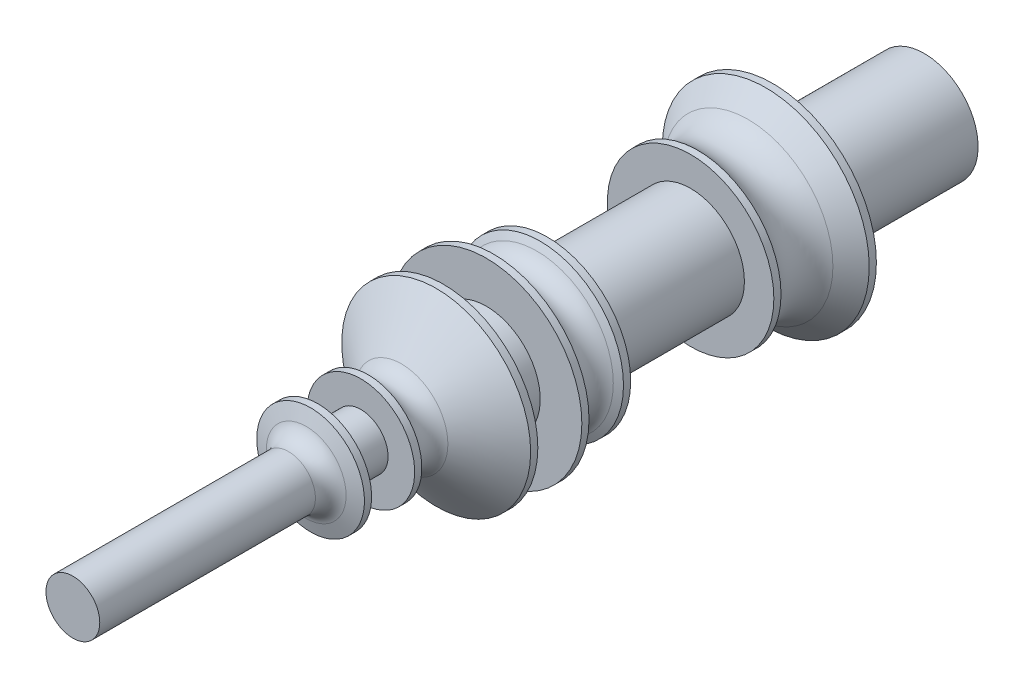
ISO-10303-21;
HEADER;
FILE_DESCRIPTION(('STEP AP214'),'2;1');
FILE_NAME('part.step','',(''),(''),'','','');
FILE_SCHEMA(('AUTOMOTIVE_DESIGN { 1 0 10303 214 1 1 1 1 }'));
ENDSEC;
DATA;
#1=APPLICATION_CONTEXT('core data for automotive mechanical design processes');
#2=APPLICATION_PROTOCOL_DEFINITION('international standard','automotive_design',2000,#1);
#3=PRODUCT_CONTEXT('',#1,'mechanical');
#4=PRODUCT('Part','Part','',(#3));
#5=PRODUCT_RELATED_PRODUCT_CATEGORY('part','',(#4));
#6=PRODUCT_DEFINITION_FORMATION('','',#4);
#7=PRODUCT_DEFINITION_CONTEXT('part definition',#1,'design');
#8=PRODUCT_DEFINITION('design','',#6,#7);
#9=PRODUCT_DEFINITION_SHAPE('','',#8);
#10=(LENGTH_UNIT() NAMED_UNIT(*) SI_UNIT(.MILLI.,.METRE.));
#11=(NAMED_UNIT(*) PLANE_ANGLE_UNIT() SI_UNIT($,.RADIAN.));
#12=(NAMED_UNIT(*) SI_UNIT($,.STERADIAN.) SOLID_ANGLE_UNIT());
#13=UNCERTAINTY_MEASURE_WITH_UNIT(LENGTH_MEASURE(1.E-05),#10,'distance_accuracy_value','');
#14=(GEOMETRIC_REPRESENTATION_CONTEXT(3) GLOBAL_UNCERTAINTY_ASSIGNED_CONTEXT((#13)) GLOBAL_UNIT_ASSIGNED_CONTEXT((#10,
#11,#12)) REPRESENTATION_CONTEXT('',''));
#15=CARTESIAN_POINT('',(0.,0.,0.));
#16=DIRECTION('',(0.,0.,1.));
#17=DIRECTION('',(1.,0.,0.));
#18=AXIS2_PLACEMENT_3D('',#15,#16,#17);
#19=CARTESIAN_POINT('',(0.,0.,520.866865037144));
#20=DIRECTION('',(0.,0.,-1.));
#21=DIRECTION('',(-1.,0.,0.));
#22=AXIS2_PLACEMENT_3D('',#19,#20,#21);
#23=CYLINDRICAL_SURFACE('',#22,43.49025);
#24=CARTESIAN_POINT('',(0.,0.,-44.7963199628567));
#25=DIRECTION('',(0.,0.,-1.));
#26=DIRECTION('',(-1.,0.,0.));
#27=AXIS2_PLACEMENT_3D('',#24,#25,#26);
#28=CIRCLE('',#27,43.49025);
#29=CARTESIAN_POINT('',(-43.49025,0.,-44.7963199628567));
#30=VERTEX_POINT('',#29);
#31=EDGE_CURVE('E68',#30,#30,#28,.T.);
#32=ORIENTED_EDGE('',*,*,#31,.T.);
#33=EDGE_LOOP('',(#32));
#34=FACE_BOUND('',#33,.T.);
#35=CARTESIAN_POINT('',(0.,0.,-167.110579962857));
#36=DIRECTION('',(0.,0.,-1.));
#37=DIRECTION('',(-1.,0.,0.));
#38=AXIS2_PLACEMENT_3D('',#35,#36,#37);
#39=CIRCLE('',#38,43.49025);
#40=CARTESIAN_POINT('',(-43.49025,0.,-167.110579962857));
#41=VERTEX_POINT('',#40);
#42=EDGE_CURVE('E128',#41,#41,#39,.T.);
#43=ORIENTED_EDGE('',*,*,#42,.F.);
#44=EDGE_LOOP('',(#43));
#45=FACE_BOUND('',#44,.T.);
#46=ADVANCED_FACE('F33',(#34,#45),#23,.T.);
#47=CARTESIAN_POINT('',(43.49025,0.,-44.7963199628567));
#48=DIRECTION('',(0.,0.,-1.));
#49=DIRECTION('',(-1.,0.,0.));
#50=AXIS2_PLACEMENT_3D('',#47,#48,#49);
#51=PLANE('',#50);
#52=ORIENTED_EDGE('',*,*,#31,.F.);
#53=EDGE_LOOP('',(#52));
#54=FACE_BOUND('',#53,.T.);
#55=CARTESIAN_POINT('',(0.,0.,-44.7963199628567));
#56=DIRECTION('',(0.,0.,1.));
#57=DIRECTION('',(1.,0.,0.));
#58=AXIS2_PLACEMENT_3D('',#55,#56,#57);
#59=CIRCLE('',#58,83.6327898078919);
#60=CARTESIAN_POINT('',(83.6327898078919,0.,-44.7963199628567));
#61=VERTEX_POINT('',#60);
#62=EDGE_CURVE('E77',#61,#61,#59,.T.);
#63=ORIENTED_EDGE('',*,*,#62,.F.);
#64=EDGE_LOOP('',(#63));
#65=FACE_BOUND('',#64,.T.);
#66=ADVANCED_FACE('F135',(#54,#65),#51,.T.);
#67=CARTESIAN_POINT('',(0.,0.,165.83626259305));
#68=DIRECTION('',(0.,0.,1.));
#69=DIRECTION('',(1.,0.,0.));
#70=AXIS2_PLACEMENT_3D('',#67,#68,#69);
#71=CYLINDRICAL_SURFACE('',#70,83.6327898078919);
#72=ORIENTED_EDGE('',*,*,#62,.T.);
#73=EDGE_LOOP('',(#72));
#74=FACE_BOUND('',#73,.T.);
#75=CARTESIAN_POINT('',(0.,0.,-38.9976199628567));
#76=DIRECTION('',(0.,0.,1.));
#77=DIRECTION('',(1.,0.,0.));
#78=AXIS2_PLACEMENT_3D('',#75,#76,#77);
#79=CIRCLE('',#78,83.6327898078919);
#80=CARTESIAN_POINT('',(83.6327898078919,0.,-38.9976199628567));
#81=VERTEX_POINT('',#80);
#82=EDGE_CURVE('E80',#81,#81,#79,.T.);
#83=ORIENTED_EDGE('',*,*,#82,.F.);
#84=EDGE_LOOP('',(#83));
#85=FACE_BOUND('',#84,.T.);
#86=ADVANCED_FACE('F143',(#74,#85),#71,.T.);
#87=CARTESIAN_POINT('',(0.,0.,-4.19031632053388));
#88=DIRECTION('',(0.,0.,-1.));
#89=DIRECTION('',(-1.,0.,0.));
#90=AXIS2_PLACEMENT_3D('',#87,#88,#89);
#91=CONICAL_SURFACE('',#90,47.1696865476448,0.808626623530185);
#92=CARTESIAN_POINT('',(0.,0.,-24.6623152596806));
#93=DIRECTION('',(0.,0.,-1.));
#94=DIRECTION('',(-1.,0.,0.));
#95=AXIS2_PLACEMENT_3D('',#92,#93,#94);
#96=CIRCLE('',#95,68.6155479947844);
#97=CARTESIAN_POINT('',(-68.6155479947844,0.,-24.6623152596806));
#98=VERTEX_POINT('',#97);
#99=EDGE_CURVE('E65',#98,#98,#96,.T.);
#100=ORIENTED_EDGE('',*,*,#99,.T.);
#101=EDGE_LOOP('',(#100));
#102=FACE_BOUND('',#101,.T.);
#103=ORIENTED_EDGE('',*,*,#82,.T.);
#104=EDGE_LOOP('',(#103));
#105=FACE_BOUND('',#104,.T.);
#106=ADVANCED_FACE('F236',(#102,#105),#91,.T.);
#107=CARTESIAN_POINT('',(0.,0.,165.83626259305));
#108=DIRECTION('',(0.,0.,1.));
#109=DIRECTION('',(1.,0.,0.));
#110=AXIS2_PLACEMENT_3D('',#107,#108,#109);
#111=CYLINDRICAL_SURFACE('',#110,67.2760719053221);
#112=CARTESIAN_POINT('',(0.,0.,15.9160690371434));
#113=DIRECTION('',(0.,0.,1.));
#114=DIRECTION('',(1.,0.,0.));
#115=AXIS2_PLACEMENT_3D('',#112,#113,#114);
#116=CIRCLE('',#115,67.2760719053221);
#117=CARTESIAN_POINT('',(67.2760719053221,0.,15.9160690371434));
#118=VERTEX_POINT('',#117);
#119=EDGE_CURVE('E83',#118,#118,#116,.T.);
#120=ORIENTED_EDGE('',*,*,#119,.T.);
#121=EDGE_LOOP('',(#120));
#122=FACE_BOUND('',#121,.T.);
#123=CARTESIAN_POINT('',(0.,0.,21.7147690371434));
#124=DIRECTION('',(0.,0.,1.));
#125=DIRECTION('',(1.,0.,0.));
#126=AXIS2_PLACEMENT_3D('',#123,#124,#125);
#127=CIRCLE('',#126,67.2760719053221);
#128=CARTESIAN_POINT('',(67.2760719053221,0.,21.7147690371434));
#129=VERTEX_POINT('',#128);
#130=EDGE_CURVE('E86',#129,#129,#127,.T.);
#131=ORIENTED_EDGE('',*,*,#130,.F.);
#132=EDGE_LOOP('',(#131));
#133=FACE_BOUND('',#132,.T.);
#134=ADVANCED_FACE('F232',(#122,#133),#111,.T.);
#135=CARTESIAN_POINT('',(67.2760719053221,0.,21.7147690371434));
#136=DIRECTION('',(0.,0.,1.));
#137=DIRECTION('',(1.,0.,0.));
#138=AXIS2_PLACEMENT_3D('',#135,#136,#137);
#139=PLANE('',#138);
#140=CARTESIAN_POINT('',(0.,0.,21.7147690371434));
#141=DIRECTION('',(0.,0.,1.));
#142=DIRECTION('',(1.,0.,0.));
#143=AXIS2_PLACEMENT_3D('',#140,#141,#142);
#144=CIRCLE('',#143,43.49025);
#145=CARTESIAN_POINT('',(43.49025,0.,21.7147690371434));
#146=VERTEX_POINT('',#145);
#147=EDGE_CURVE('E71',#146,#146,#144,.T.);
#148=ORIENTED_EDGE('',*,*,#147,.F.);
#149=EDGE_LOOP('',(#148));
#150=FACE_BOUND('',#149,.T.);
#151=ORIENTED_EDGE('',*,*,#130,.T.);
#152=EDGE_LOOP('',(#151));
#153=FACE_BOUND('',#152,.T.);
#154=ADVANCED_FACE('F150',(#150,#153),#139,.T.);
#155=ORIENTED_EDGE('',*,*,#147,.T.);
#156=EDGE_LOOP('',(#155));
#157=FACE_BOUND('',#156,.T.);
#158=CARTESIAN_POINT('',(0.,0.,137.398834037143));
#159=DIRECTION('',(0.,0.,-1.));
#160=DIRECTION('',(-1.,0.,0.));
#161=AXIS2_PLACEMENT_3D('',#158,#159,#160);
#162=CIRCLE('',#161,43.49025);
#163=CARTESIAN_POINT('',(-43.49025,0.,137.398834037143));
#164=VERTEX_POINT('',#163);
#165=EDGE_CURVE('E74',#164,#164,#162,.T.);
#166=ORIENTED_EDGE('',*,*,#165,.T.);
#167=EDGE_LOOP('',(#166));
#168=FACE_BOUND('',#167,.T.);
#169=ADVANCED_FACE('F138',(#157,#168),#23,.T.);
#170=CARTESIAN_POINT('',(21.745125,0.,137.398834037143));
#171=DIRECTION('',(0.,0.,-1.));
#172=DIRECTION('',(-1.,0.,0.));
#173=AXIS2_PLACEMENT_3D('',#170,#171,#172);
#174=PLANE('',#173);
#175=ORIENTED_EDGE('',*,*,#165,.F.);
#176=EDGE_LOOP('',(#175));
#177=FACE_BOUND('',#176,.T.);
#178=CARTESIAN_POINT('',(0.,0.,137.398834037143));
#179=DIRECTION('',(0.,0.,1.));
#180=DIRECTION('',(1.,0.,0.));
#181=AXIS2_PLACEMENT_3D('',#178,#179,#180);
#182=CIRCLE('',#181,67.2760719053221);
#183=CARTESIAN_POINT('',(67.2760719053221,0.,137.398834037143));
#184=VERTEX_POINT('',#183);
#185=EDGE_CURVE('E89',#184,#184,#182,.T.);
#186=ORIENTED_EDGE('',*,*,#185,.F.);
#187=EDGE_LOOP('',(#186));
#188=FACE_BOUND('',#187,.T.);
#189=ADVANCED_FACE('F149',(#177,#188),#174,.T.);
#190=CARTESIAN_POINT('',(0.,0.,165.83626259305));
#191=DIRECTION('',(0.,0.,1.));
#192=DIRECTION('',(1.,0.,0.));
#193=AXIS2_PLACEMENT_3D('',#190,#191,#192);
#194=CYLINDRICAL_SURFACE('',#193,67.2760719053221);
#195=ORIENTED_EDGE('',*,*,#185,.T.);
#196=EDGE_LOOP('',(#195));
#197=FACE_BOUND('',#196,.T.);
#198=CARTESIAN_POINT('',(0.,0.,143.197534037143));
#199=DIRECTION('',(0.,0.,1.));
#200=DIRECTION('',(1.,0.,0.));
#201=AXIS2_PLACEMENT_3D('',#198,#199,#200);
#202=CIRCLE('',#201,67.2760719053221);
#203=CARTESIAN_POINT('',(67.2760719053221,0.,143.197534037143));
#204=VERTEX_POINT('',#203);
#205=EDGE_CURVE('E92',#204,#204,#202,.T.);
#206=ORIENTED_EDGE('',*,*,#205,.F.);
#207=EDGE_LOOP('',(#206));
#208=FACE_BOUND('',#207,.T.);
#209=ADVANCED_FACE('F222',(#197,#208),#194,.T.);
#210=CARTESIAN_POINT('',(0.,0.,165.83626259305));
#211=DIRECTION('',(0.,0.,-1.));
#212=DIRECTION('',(-1.,0.,0.));
#213=AXIS2_PLACEMENT_3D('',#210,#211,#212);
#214=CONICAL_SURFACE('',#213,21.745125,1.10937816358119);
#215=CARTESIAN_POINT('',(0.,0.,145.940981618358));
#216=DIRECTION('',(0.,0.,1.));
#217=DIRECTION('',(1.,0.,0.));
#218=AXIS2_PLACEMENT_3D('',#215,#216,#217);
#219=CIRCLE('',#218,61.7584578816655);
#220=CARTESIAN_POINT('',(61.7584578816655,0.,145.940981618358));
#221=VERTEX_POINT('',#220);
#222=EDGE_CURVE('E53',#221,#221,#219,.F.);
#223=ORIENTED_EDGE('',*,*,#222,.T.);
#224=EDGE_LOOP('',(#223));
#225=FACE_BOUND('',#224,.T.);
#226=ORIENTED_EDGE('',*,*,#205,.T.);
#227=EDGE_LOOP('',(#226));
#228=FACE_BOUND('',#227,.T.);
#229=ADVANCED_FACE('F218',(#225,#228),#214,.T.);
#230=CARTESIAN_POINT('',(0.,0.,-3.69016999697235));
#231=DIRECTION('',(0.,0.,1.));
#232=DIRECTION('',(1.,0.,0.));
#233=AXIS2_PLACEMENT_3D('',#230,#231,#232);
#234=TOROIDAL_SURFACE('',#233,88.6353423326359,28.9935);
#235=ORIENTED_EDGE('',*,*,#99,.F.);
#236=EDGE_LOOP('',(#235));
#237=FACE_BOUND('',#236,.T.);
#238=ORIENTED_EDGE('',*,*,#119,.F.);
#239=EDGE_LOOP('',(#238));
#240=FACE_BOUND('',#239,.T.);
#241=ADVANCED_FACE('F221',(#237,#240),#234,.F.);
#242=CARTESIAN_POINT('',(0.,21.303462586395,186.687784037143));
#243=DIRECTION('',(0.,0.,-1.));
#244=DIRECTION('',(-1.,0.,0.));
#245=AXIS2_PLACEMENT_3D('',#242,#243,#244);
#246=PLANE('',#245);
#247=CARTESIAN_POINT('',(0.,0.,186.687784037143));
#248=DIRECTION('',(0.,0.,-1.));
#249=DIRECTION('',(-1.,0.,0.));
#250=AXIS2_PLACEMENT_3D('',#247,#248,#249);
#251=CIRCLE('',#250,43.49025);
#252=CARTESIAN_POINT('',(-43.49025,0.,186.687784037143));
#253=VERTEX_POINT('',#252);
#254=EDGE_CURVE('E62',#253,#253,#251,.T.);
#255=ORIENTED_EDGE('',*,*,#254,.T.);
#256=EDGE_LOOP('',(#255));
#257=FACE_BOUND('',#256,.T.);
#258=CARTESIAN_POINT('',(0.,0.,186.687784037143));
#259=DIRECTION('',(0.,0.,1.));
#260=DIRECTION('',(1.,0.,0.));
#261=AXIS2_PLACEMENT_3D('',#258,#259,#260);
#262=CIRCLE('',#261,77.1095663962794);
#263=CARTESIAN_POINT('',(77.1095663962794,0.,186.687784037143));
#264=VERTEX_POINT('',#263);
#265=EDGE_CURVE('E119',#264,#264,#262,.T.);
#266=ORIENTED_EDGE('',*,*,#265,.T.);
#267=EDGE_LOOP('',(#266));
#268=FACE_BOUND('',#267,.T.);
#269=ADVANCED_FACE('F286',(#257,#268),#246,.F.);
#270=CARTESIAN_POINT('',(0.,0.,282.366334037143));
#271=DIRECTION('',(0.,0.,1.));
#272=DIRECTION('',(1.,0.,0.));
#273=AXIS2_PLACEMENT_3D('',#270,#271,#272);
#274=CYLINDRICAL_SURFACE('',#273,77.1095663962794);
#275=ORIENTED_EDGE('',*,*,#265,.F.);
#276=EDGE_LOOP('',(#275));
#277=FACE_BOUND('',#276,.T.);
#278=CARTESIAN_POINT('',(0.,0.,180.889084037143));
#279=DIRECTION('',(0.,0.,1.));
#280=DIRECTION('',(1.,0.,0.));
#281=AXIS2_PLACEMENT_3D('',#278,#279,#280);
#282=CIRCLE('',#281,77.1095663962794);
#283=CARTESIAN_POINT('',(77.1095663962794,0.,180.889084037143));
#284=VERTEX_POINT('',#283);
#285=EDGE_CURVE('E122',#284,#284,#282,.T.);
#286=ORIENTED_EDGE('',*,*,#285,.T.);
#287=EDGE_LOOP('',(#286));
#288=FACE_BOUND('',#287,.T.);
#289=ADVANCED_FACE('F162',(#277,#288),#274,.T.);
#290=CARTESIAN_POINT('',(0.,0.,140.298184037143));
#291=DIRECTION('',(0.,0.,1.));
#292=DIRECTION('',(1.,0.,0.));
#293=AXIS2_PLACEMENT_3D('',#290,#291,#292);
#294=CONICAL_SURFACE('',#293,0.,1.08624814832656);
#295=CARTESIAN_POINT('',(0.,0.,172.645594231976));
#296=DIRECTION('',(0.,0.,-1.));
#297=DIRECTION('',(-1.,0.,0.));
#298=AXIS2_PLACEMENT_3D('',#295,#296,#297);
#299=CIRCLE('',#298,61.4496050633552);
#300=CARTESIAN_POINT('',(-61.4496050633552,0.,172.645594231976));
#301=VERTEX_POINT('',#300);
#302=EDGE_CURVE('E56',#301,#301,#299,.F.);
#303=ORIENTED_EDGE('',*,*,#302,.T.);
#304=EDGE_LOOP('',(#303));
#305=FACE_BOUND('',#304,.T.);
#306=ORIENTED_EDGE('',*,*,#285,.F.);
#307=EDGE_LOOP('',(#306));
#308=FACE_BOUND('',#307,.T.);
#309=ADVANCED_FACE('F154',(#305,#308),#294,.T.);
#310=ORIENTED_EDGE('',*,*,#254,.F.);
#311=EDGE_LOOP('',(#310));
#312=FACE_BOUND('',#311,.T.);
#313=CARTESIAN_POINT('',(0.,0.,221.479984037143));
#314=DIRECTION('',(0.,0.,1.));
#315=DIRECTION('',(1.,0.,0.));
#316=AXIS2_PLACEMENT_3D('',#313,#314,#315);
#317=CIRCLE('',#316,43.49025);
#318=CARTESIAN_POINT('',(43.49025,0.,221.479984037143));
#319=VERTEX_POINT('',#318);
#320=EDGE_CURVE('E59',#319,#319,#317,.F.);
#321=ORIENTED_EDGE('',*,*,#320,.T.);
#322=EDGE_LOOP('',(#321));
#323=FACE_BOUND('',#322,.T.);
#324=ADVANCED_FACE('F139',(#312,#323),#23,.T.);
#325=CARTESIAN_POINT('',(0.,0.,520.866865037144));
#326=DIRECTION('',(0.,0.,1.));
#327=DIRECTION('',(1.,0.,0.));
#328=AXIS2_PLACEMENT_3D('',#325,#326,#327);
#329=PLANE('',#328);
#330=CARTESIAN_POINT('',(0.,0.,520.866865037144));
#331=DIRECTION('',(0.,0.,1.));
#332=DIRECTION('',(1.,0.,0.));
#333=AXIS2_PLACEMENT_3D('',#330,#331,#332);
#334=CIRCLE('',#333,21.745125);
#335=CARTESIAN_POINT('',(21.745125,0.,520.866865037144));
#336=VERTEX_POINT('',#335);
#337=EDGE_CURVE('E95',#336,#336,#334,.T.);
#338=ORIENTED_EDGE('',*,*,#337,.T.);
#339=EDGE_LOOP('',(#338));
#340=FACE_BOUND('',#339,.T.);
#341=ADVANCED_FACE('F153',(#340),#329,.T.);
#342=CARTESIAN_POINT('',(0.,0.,520.866865037144));
#343=DIRECTION('',(0.,0.,1.));
#344=DIRECTION('',(1.,0.,0.));
#345=AXIS2_PLACEMENT_3D('',#342,#343,#344);
#346=CYLINDRICAL_SURFACE('',#345,21.745125);
#347=CARTESIAN_POINT('',(0.,0.,346.620116666411));
#348=DIRECTION('',(0.,0.,1.));
#349=DIRECTION('',(1.,0.,0.));
#350=AXIS2_PLACEMENT_3D('',#347,#348,#349);
#351=CIRCLE('',#350,21.745125);
#352=CARTESIAN_POINT('',(21.745125,0.,346.620116666411));
#353=VERTEX_POINT('',#352);
#354=EDGE_CURVE('E48',#353,#353,#351,.T.);
#355=ORIENTED_EDGE('',*,*,#354,.T.);
#356=EDGE_LOOP('',(#355));
#357=FACE_BOUND('',#356,.T.);
#358=ORIENTED_EDGE('',*,*,#337,.F.);
#359=EDGE_LOOP('',(#358));
#360=FACE_BOUND('',#359,.T.);
#361=ADVANCED_FACE('F160',(#357,#360),#346,.T.);
#362=CARTESIAN_POINT('',(0.,0.,328.755934037143));
#363=DIRECTION('',(0.,0.,-1.));
#364=DIRECTION('',(-1.,0.,0.));
#365=AXIS2_PLACEMENT_3D('',#362,#363,#364);
#366=CONICAL_SURFACE('',#365,43.49025,1.26459527909732);
#367=CARTESIAN_POINT('',(0.,0.,332.317832692537));
#368=DIRECTION('',(0.,0.,1.));
#369=DIRECTION('',(1.,0.,0.));
#370=AXIS2_PLACEMENT_3D('',#367,#368,#369);
#371=CIRCLE('',#370,32.2235463895305);
#372=CARTESIAN_POINT('',(32.2235463895306,0.,332.317832692537));
#373=VERTEX_POINT('',#372);
#374=EDGE_CURVE('E44',#373,#373,#371,.F.);
#375=ORIENTED_EDGE('',*,*,#374,.T.);
#376=EDGE_LOOP('',(#375));
#377=FACE_BOUND('',#376,.T.);
#378=CARTESIAN_POINT('',(0.,0.,328.755934037143));
#379=DIRECTION('',(0.,0.,-1.));
#380=DIRECTION('',(-1.,0.,0.));
#381=AXIS2_PLACEMENT_3D('',#378,#379,#380);
#382=CIRCLE('',#381,43.49025);
#383=CARTESIAN_POINT('',(-43.49025,0.,328.755934037143));
#384=VERTEX_POINT('',#383);
#385=EDGE_CURVE('E113',#384,#384,#382,.T.);
#386=ORIENTED_EDGE('',*,*,#385,.F.);
#387=EDGE_LOOP('',(#386));
#388=FACE_BOUND('',#387,.T.);
#389=ADVANCED_FACE('F189',(#377,#388),#366,.T.);
#390=CARTESIAN_POINT('',(0.,0.,267.869584037143));
#391=DIRECTION('',(0.,0.,-1.));
#392=DIRECTION('',(-1.,0.,0.));
#393=AXIS2_PLACEMENT_3D('',#390,#391,#392);
#394=CYLINDRICAL_SURFACE('',#393,43.49025);
#395=ORIENTED_EDGE('',*,*,#385,.T.);
#396=EDGE_LOOP('',(#395));
#397=FACE_BOUND('',#396,.T.);
#398=CARTESIAN_POINT('',(0.,0.,322.957234037143));
#399=DIRECTION('',(0.,0.,-1.));
#400=DIRECTION('',(-1.,0.,0.));
#401=AXIS2_PLACEMENT_3D('',#398,#399,#400);
#402=CIRCLE('',#401,43.49025);
#403=CARTESIAN_POINT('',(-43.49025,0.,322.957234037143));
#404=VERTEX_POINT('',#403);
#405=EDGE_CURVE('E98',#404,#404,#402,.T.);
#406=ORIENTED_EDGE('',*,*,#405,.F.);
#407=EDGE_LOOP('',(#406));
#408=FACE_BOUND('',#407,.T.);
#409=ADVANCED_FACE('F192',(#397,#408),#394,.T.);
#410=CARTESIAN_POINT('',(-22.0048119478809,0.,322.957234037143));
#411=DIRECTION('',(0.,0.,-1.));
#412=DIRECTION('',(-1.,0.,0.));
#413=AXIS2_PLACEMENT_3D('',#410,#411,#412);
#414=PLANE('',#413);
#415=ORIENTED_EDGE('',*,*,#405,.T.);
#416=EDGE_LOOP('',(#415));
#417=FACE_BOUND('',#416,.T.);
#418=CARTESIAN_POINT('',(0.,0.,322.957234037143));
#419=DIRECTION('',(0.,0.,-1.));
#420=DIRECTION('',(-1.,0.,0.));
#421=AXIS2_PLACEMENT_3D('',#418,#419,#420);
#422=CIRCLE('',#421,22.0048119478809);
#423=CARTESIAN_POINT('',(-22.0048119478809,0.,322.957234037143));
#424=VERTEX_POINT('',#423);
#425=EDGE_CURVE('E101',#424,#424,#422,.T.);
#426=ORIENTED_EDGE('',*,*,#425,.F.);
#427=EDGE_LOOP('',(#426));
#428=FACE_BOUND('',#427,.T.);
#429=ADVANCED_FACE('F207',(#417,#428),#414,.T.);
#430=CARTESIAN_POINT('',(0.,0.,267.869584037143));
#431=DIRECTION('',(0.,0.,-1.));
#432=DIRECTION('',(-1.,0.,0.));
#433=AXIS2_PLACEMENT_3D('',#430,#431,#432);
#434=CYLINDRICAL_SURFACE('',#433,22.0048119478809);
#435=ORIENTED_EDGE('',*,*,#425,.T.);
#436=EDGE_LOOP('',(#435));
#437=FACE_BOUND('',#436,.T.);
#438=CARTESIAN_POINT('',(0.,0.,288.165034037143));
#439=DIRECTION('',(0.,0.,-1.));
#440=DIRECTION('',(-1.,0.,0.));
#441=AXIS2_PLACEMENT_3D('',#438,#439,#440);
#442=CIRCLE('',#441,22.0048119478809);
#443=CARTESIAN_POINT('',(-22.0048119478809,0.,288.165034037143));
#444=VERTEX_POINT('',#443);
#445=EDGE_CURVE('E104',#444,#444,#442,.T.);
#446=ORIENTED_EDGE('',*,*,#445,.F.);
#447=EDGE_LOOP('',(#446));
#448=FACE_BOUND('',#447,.T.);
#449=ADVANCED_FACE('F203',(#437,#448),#434,.T.);
#450=CARTESIAN_POINT('',(-22.0048119478809,0.,288.165034037143));
#451=DIRECTION('',(0.,0.,1.));
#452=DIRECTION('',(1.,0.,0.));
#453=AXIS2_PLACEMENT_3D('',#450,#451,#452);
#454=PLANE('',#453);
#455=ORIENTED_EDGE('',*,*,#445,.T.);
#456=EDGE_LOOP('',(#455));
#457=FACE_BOUND('',#456,.T.);
#458=CARTESIAN_POINT('',(0.,0.,288.165034037143));
#459=DIRECTION('',(0.,0.,-1.));
#460=DIRECTION('',(-1.,0.,0.));
#461=AXIS2_PLACEMENT_3D('',#458,#459,#460);
#462=CIRCLE('',#461,43.49025);
#463=CARTESIAN_POINT('',(-43.49025,0.,288.165034037143));
#464=VERTEX_POINT('',#463);
#465=EDGE_CURVE('E107',#464,#464,#462,.T.);
#466=ORIENTED_EDGE('',*,*,#465,.F.);
#467=EDGE_LOOP('',(#466));
#468=FACE_BOUND('',#467,.T.);
#469=ADVANCED_FACE('F199',(#457,#468),#454,.T.);
#470=CARTESIAN_POINT('',(0.,0.,267.869584037143));
#471=DIRECTION('',(0.,0.,-1.));
#472=DIRECTION('',(-1.,0.,0.));
#473=AXIS2_PLACEMENT_3D('',#470,#471,#472);
#474=CYLINDRICAL_SURFACE('',#473,43.49025);
#475=ORIENTED_EDGE('',*,*,#465,.T.);
#476=EDGE_LOOP('',(#475));
#477=FACE_BOUND('',#476,.T.);
#478=CARTESIAN_POINT('',(0.,0.,282.366334037143));
#479=DIRECTION('',(0.,0.,-1.));
#480=DIRECTION('',(-1.,0.,0.));
#481=AXIS2_PLACEMENT_3D('',#478,#479,#480);
#482=CIRCLE('',#481,43.49025);
#483=CARTESIAN_POINT('',(-43.49025,0.,282.366334037143));
#484=VERTEX_POINT('',#483);
#485=EDGE_CURVE('E110',#484,#484,#482,.T.);
#486=ORIENTED_EDGE('',*,*,#485,.F.);
#487=EDGE_LOOP('',(#486));
#488=FACE_BOUND('',#487,.T.);
#489=ADVANCED_FACE('F196',(#477,#488),#474,.T.);
#490=CARTESIAN_POINT('',(0.,0.,267.869584037143));
#491=DIRECTION('',(0.,0.,1.));
#492=DIRECTION('',(1.,0.,0.));
#493=AXIS2_PLACEMENT_3D('',#490,#491,#492);
#494=CONICAL_SURFACE('',#493,0.,1.24904577239825);
#495=CARTESIAN_POINT('',(0.,0.,281.708694752959));
#496=DIRECTION('',(0.,0.,-1.));
#497=DIRECTION('',(-1.,0.,0.));
#498=AXIS2_PLACEMENT_3D('',#495,#496,#497);
#499=CIRCLE('',#498,41.5173321474484);
#500=CARTESIAN_POINT('',(-41.5173321474484,0.,281.708694752959));
#501=VERTEX_POINT('',#500);
#502=EDGE_CURVE('E10',#501,#501,#499,.F.);
#503=ORIENTED_EDGE('',*,*,#502,.T.);
#504=EDGE_LOOP('',(#503));
#505=FACE_BOUND('',#504,.T.);
#506=ORIENTED_EDGE('',*,*,#485,.T.);
#507=EDGE_LOOP('',(#506));
#508=FACE_BOUND('',#507,.T.);
#509=ADVANCED_FACE('F184',(#505,#508),#494,.T.);
#510=CARTESIAN_POINT('',(0.,0.,227.278684037143));
#511=DIRECTION('',(0.,0.,-1.));
#512=DIRECTION('',(-1.,0.,0.));
#513=AXIS2_PLACEMENT_3D('',#510,#511,#512);
#514=CONICAL_SURFACE('',#513,76.3306149788413,0.94565591024046);
#515=CARTESIAN_POINT('',(0.,0.,255.315230969688));
#516=DIRECTION('',(0.,0.,1.));
#517=DIRECTION('',(1.,0.,0.));
#518=AXIS2_PLACEMENT_3D('',#515,#516,#517);
#519=CIRCLE('',#518,37.4825815404164);
#520=CARTESIAN_POINT('',(37.4825815404163,0.,255.315230969688));
#521=VERTEX_POINT('',#520);
#522=EDGE_CURVE('E40',#521,#521,#519,.F.);
#523=ORIENTED_EDGE('',*,*,#522,.T.);
#524=EDGE_LOOP('',(#523));
#525=FACE_BOUND('',#524,.T.);
#526=CARTESIAN_POINT('',(0.,0.,227.278684037143));
#527=DIRECTION('',(0.,0.,1.));
#528=DIRECTION('',(1.,0.,0.));
#529=AXIS2_PLACEMENT_3D('',#526,#527,#528);
#530=CIRCLE('',#529,76.3306149788413);
#531=CARTESIAN_POINT('',(76.3306149788413,0.,227.278684037143));
#532=VERTEX_POINT('',#531);
#533=EDGE_CURVE('E125',#532,#532,#530,.T.);
#534=ORIENTED_EDGE('',*,*,#533,.T.);
#535=EDGE_LOOP('',(#534));
#536=FACE_BOUND('',#535,.T.);
#537=ADVANCED_FACE('F178',(#525,#536),#514,.T.);
#538=CARTESIAN_POINT('',(0.,0.,282.366334037143));
#539=DIRECTION('',(0.,0.,1.));
#540=DIRECTION('',(1.,0.,0.));
#541=AXIS2_PLACEMENT_3D('',#538,#539,#540);
#542=CYLINDRICAL_SURFACE('',#541,76.3306149788413);
#543=ORIENTED_EDGE('',*,*,#533,.F.);
#544=EDGE_LOOP('',(#543));
#545=FACE_BOUND('',#544,.T.);
#546=CARTESIAN_POINT('',(0.,0.,221.479984037143));
#547=DIRECTION('',(0.,0.,1.));
#548=DIRECTION('',(1.,0.,0.));
#549=AXIS2_PLACEMENT_3D('',#546,#547,#548);
#550=CIRCLE('',#549,76.3306149788413);
#551=CARTESIAN_POINT('',(76.3306149788413,0.,221.479984037143));
#552=VERTEX_POINT('',#551);
#553=EDGE_CURVE('E116',#552,#552,#550,.T.);
#554=ORIENTED_EDGE('',*,*,#553,.T.);
#555=EDGE_LOOP('',(#554));
#556=FACE_BOUND('',#555,.T.);
#557=ADVANCED_FACE('F173',(#545,#556),#542,.T.);
#558=CARTESIAN_POINT('',(0.,21.303462586395,221.479984037143));
#559=DIRECTION('',(0.,0.,1.));
#560=DIRECTION('',(1.,0.,0.));
#561=AXIS2_PLACEMENT_3D('',#558,#559,#560);
#562=PLANE('',#561);
#563=ORIENTED_EDGE('',*,*,#320,.F.);
#564=EDGE_LOOP('',(#563));
#565=FACE_BOUND('',#564,.T.);
#566=ORIENTED_EDGE('',*,*,#553,.F.);
#567=EDGE_LOOP('',(#566));
#568=FACE_BOUND('',#567,.T.);
#569=ADVANCED_FACE('F169',(#565,#568),#562,.F.);
#570=CARTESIAN_POINT('',(0.,0.,159.37231170533));
#571=DIRECTION('',(0.,0.,1.));
#572=DIRECTION('',(1.,0.,0.));
#573=AXIS2_PLACEMENT_3D('',#570,#571,#572);
#574=TOROIDAL_SURFACE('',#573,68.4367340136336,15.);
#575=ORIENTED_EDGE('',*,*,#222,.F.);
#576=EDGE_LOOP('',(#575));
#577=FACE_BOUND('',#576,.T.);
#578=ORIENTED_EDGE('',*,*,#302,.F.);
#579=EDGE_LOOP('',(#578));
#580=FACE_BOUND('',#579,.T.);
#581=ADVANCED_FACE('F172',(#577,#580),#574,.F.);
#582=CARTESIAN_POINT('',(0.,0.,346.620116666411));
#583=DIRECTION('',(0.,0.,1.));
#584=DIRECTION('',(1.,0.,0.));
#585=AXIS2_PLACEMENT_3D('',#582,#583,#584);
#586=TOROIDAL_SURFACE('',#585,36.745125,15.);
#587=ORIENTED_EDGE('',*,*,#374,.F.);
#588=EDGE_LOOP('',(#587));
#589=FACE_BOUND('',#588,.T.);
#590=ORIENTED_EDGE('',*,*,#354,.F.);
#591=EDGE_LOOP('',(#590));
#592=FACE_BOUND('',#591,.T.);
#593=ADVANCED_FACE('F388',(#589,#592),#586,.F.);
#594=CARTESIAN_POINT('',(0.,0.,267.478445282202));
#595=DIRECTION('',(0.,0.,-1.));
#596=DIRECTION('',(-1.,0.,0.));
#597=AXIS2_PLACEMENT_3D('',#594,#595,#596);
#598=TOROIDAL_SURFACE('',#597,46.260748637701,15.);
#599=ORIENTED_EDGE('',*,*,#502,.F.);
#600=EDGE_LOOP('',(#599));
#601=FACE_BOUND('',#600,.T.);
#602=ORIENTED_EDGE('',*,*,#522,.F.);
#603=EDGE_LOOP('',(#602));
#604=FACE_BOUND('',#603,.T.);
#605=ADVANCED_FACE('F35',(#601,#604),#598,.F.);
#606=CARTESIAN_POINT('',(0.,0.,-167.110579962857));
#607=DIRECTION('',(0.,0.,-1.));
#608=DIRECTION('',(-1.,0.,0.));
#609=AXIS2_PLACEMENT_3D('',#606,#607,#608);
#610=PLANE('',#609);
#611=ORIENTED_EDGE('',*,*,#42,.T.);
#612=EDGE_LOOP('',(#611));
#613=FACE_BOUND('',#612,.T.);
#614=ADVANCED_FACE('F132',(#613),#610,.T.);
#615=CLOSED_SHELL('',(#46,#66,#86,#106,#134,#154,#169,#189,#209,#229,#241,#269,#289,#309,#324,
#341,#361,#389,#409,#429,#449,#469,#489,#509,#537,#557,#569,#581,#593,#605,#614));
#616=MANIFOLD_SOLID_BREP('B2',#615);
#617=ADVANCED_BREP_SHAPE_REPRESENTATION('',(#18,#616),#14);
#618=SHAPE_DEFINITION_REPRESENTATION(#9,#617);
ENDSEC;
END-ISO-10303-21;
